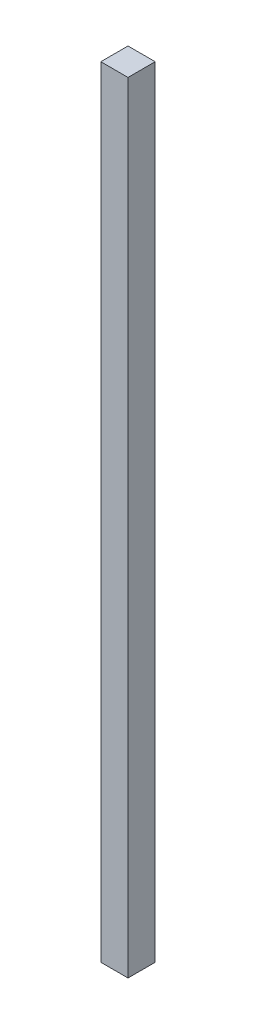
ISO-10303-21;
HEADER;
FILE_DESCRIPTION(('STEP AP214'),'2;1');
FILE_NAME('part.step','',(''),(''),'','','');
FILE_SCHEMA(('AUTOMOTIVE_DESIGN { 1 0 10303 214 1 1 1 1 }'));
ENDSEC;
DATA;
#1=APPLICATION_CONTEXT('core data for automotive mechanical design processes');
#2=APPLICATION_PROTOCOL_DEFINITION('international standard','automotive_design',2000,#1);
#3=PRODUCT_CONTEXT('',#1,'mechanical');
#4=PRODUCT('Part','Part','',(#3));
#5=PRODUCT_RELATED_PRODUCT_CATEGORY('part','',(#4));
#6=PRODUCT_DEFINITION_FORMATION('','',#4);
#7=PRODUCT_DEFINITION_CONTEXT('part definition',#1,'design');
#8=PRODUCT_DEFINITION('design','',#6,#7);
#9=PRODUCT_DEFINITION_SHAPE('','',#8);
#10=(LENGTH_UNIT() NAMED_UNIT(*) SI_UNIT(.MILLI.,.METRE.));
#11=(NAMED_UNIT(*) PLANE_ANGLE_UNIT() SI_UNIT($,.RADIAN.));
#12=(NAMED_UNIT(*) SI_UNIT($,.STERADIAN.) SOLID_ANGLE_UNIT());
#13=UNCERTAINTY_MEASURE_WITH_UNIT(LENGTH_MEASURE(1.E-05),#10,'distance_accuracy_value','');
#14=(GEOMETRIC_REPRESENTATION_CONTEXT(3) GLOBAL_UNCERTAINTY_ASSIGNED_CONTEXT((#13)) GLOBAL_UNIT_ASSIGNED_CONTEXT((#10,
#11,#12)) REPRESENTATION_CONTEXT('',''));
#15=CARTESIAN_POINT('',(0.,0.,0.));
#16=DIRECTION('',(0.,0.,1.));
#17=DIRECTION('',(1.,0.,0.));
#18=AXIS2_PLACEMENT_3D('',#15,#16,#17);
#19=CARTESIAN_POINT('',(0.,1092.2,0.));
#20=DIRECTION('',(1.,0.,0.));
#21=DIRECTION('',(0.,0.,-1.));
#22=AXIS2_PLACEMENT_3D('',#19,#20,#21);
#23=PLANE('',#22);
#24=DIRECTION('',(0.,0.,1.));
#25=VECTOR('',#24,1.);
#26=CARTESIAN_POINT('',(0.,0.,0.));
#27=LINE('',#26,#25);
#28=CARTESIAN_POINT('',(0.,0.,-38.1));
#29=VERTEX_POINT('',#28);
#30=CARTESIAN_POINT('',(0.,0.,0.));
#31=VERTEX_POINT('',#30);
#32=EDGE_CURVE('E96',#29,#31,#27,.T.);
#33=ORIENTED_EDGE('',*,*,#32,.T.);
#34=DIRECTION('',(0.,-1.,0.));
#35=VECTOR('',#34,1.);
#36=CARTESIAN_POINT('',(0.,1092.2,0.));
#37=LINE('',#36,#35);
#38=CARTESIAN_POINT('',(0.,1092.2,0.));
#39=VERTEX_POINT('',#38);
#40=EDGE_CURVE('E11',#39,#31,#37,.T.);
#41=ORIENTED_EDGE('',*,*,#40,.F.);
#42=DIRECTION('',(0.,0.,1.));
#43=VECTOR('',#42,1.);
#44=CARTESIAN_POINT('',(0.,1092.2,0.));
#45=LINE('',#44,#43);
#46=CARTESIAN_POINT('',(0.,1092.2,-38.1));
#47=VERTEX_POINT('',#46);
#48=EDGE_CURVE('E84',#47,#39,#45,.T.);
#49=ORIENTED_EDGE('',*,*,#48,.F.);
#50=DIRECTION('',(0.,-1.,0.));
#51=VECTOR('',#50,1.);
#52=CARTESIAN_POINT('',(0.,1092.2,-38.1));
#53=LINE('',#52,#51);
#54=EDGE_CURVE('E92',#47,#29,#53,.T.);
#55=ORIENTED_EDGE('',*,*,#54,.T.);
#56=EDGE_LOOP('',(#33,#41,#49,#55));
#57=FACE_BOUND('',#56,.T.);
#58=ADVANCED_FACE('F33',(#57),#23,.F.);
#59=CARTESIAN_POINT('',(0.,1092.2,0.));
#60=DIRECTION('',(0.,0.,-1.));
#61=DIRECTION('',(-1.,0.,0.));
#62=AXIS2_PLACEMENT_3D('',#59,#60,#61);
#63=PLANE('',#62);
#64=DIRECTION('',(1.,0.,0.));
#65=VECTOR('',#64,1.);
#66=CARTESIAN_POINT('',(0.,0.,0.));
#67=LINE('',#66,#65);
#68=CARTESIAN_POINT('',(38.1,0.,0.));
#69=VERTEX_POINT('',#68);
#70=EDGE_CURVE('E88',#31,#69,#67,.T.);
#71=ORIENTED_EDGE('',*,*,#70,.T.);
#72=DIRECTION('',(0.,-1.,0.));
#73=VECTOR('',#72,1.);
#74=CARTESIAN_POINT('',(38.1,1092.2,0.));
#75=LINE('',#74,#73);
#76=CARTESIAN_POINT('',(38.1,1092.2,0.));
#77=VERTEX_POINT('',#76);
#78=EDGE_CURVE('E41',#77,#69,#75,.T.);
#79=ORIENTED_EDGE('',*,*,#78,.F.);
#80=DIRECTION('',(1.,0.,0.));
#81=VECTOR('',#80,1.);
#82=CARTESIAN_POINT('',(0.,1092.2,0.));
#83=LINE('',#82,#81);
#84=EDGE_CURVE('E79',#39,#77,#83,.T.);
#85=ORIENTED_EDGE('',*,*,#84,.F.);
#86=ORIENTED_EDGE('',*,*,#40,.T.);
#87=EDGE_LOOP('',(#71,#79,#85,#86));
#88=FACE_BOUND('',#87,.T.);
#89=ADVANCED_FACE('F87',(#88),#63,.F.);
#90=CARTESIAN_POINT('',(38.1,1092.2,0.));
#91=DIRECTION('',(-1.,0.,0.));
#92=DIRECTION('',(0.,0.,1.));
#93=AXIS2_PLACEMENT_3D('',#90,#91,#92);
#94=PLANE('',#93);
#95=DIRECTION('',(0.,0.,-1.));
#96=VECTOR('',#95,1.);
#97=CARTESIAN_POINT('',(38.1,0.,0.));
#98=LINE('',#97,#96);
#99=CARTESIAN_POINT('',(38.1,0.,-38.1));
#100=VERTEX_POINT('',#99);
#101=EDGE_CURVE('E66',#69,#100,#98,.T.);
#102=ORIENTED_EDGE('',*,*,#101,.T.);
#103=DIRECTION('',(0.,-1.,0.));
#104=VECTOR('',#103,1.);
#105=CARTESIAN_POINT('',(38.1,1092.2,-38.1));
#106=LINE('',#105,#104);
#107=CARTESIAN_POINT('',(38.1,1092.2,-38.1));
#108=VERTEX_POINT('',#107);
#109=EDGE_CURVE('E89',#108,#100,#106,.T.);
#110=ORIENTED_EDGE('',*,*,#109,.F.);
#111=DIRECTION('',(0.,0.,-1.));
#112=VECTOR('',#111,1.);
#113=CARTESIAN_POINT('',(38.1,1092.2,0.));
#114=LINE('',#113,#112);
#115=EDGE_CURVE('E82',#77,#108,#114,.T.);
#116=ORIENTED_EDGE('',*,*,#115,.F.);
#117=ORIENTED_EDGE('',*,*,#78,.T.);
#118=EDGE_LOOP('',(#102,#110,#116,#117));
#119=FACE_BOUND('',#118,.T.);
#120=ADVANCED_FACE('F90',(#119),#94,.F.);
#121=CARTESIAN_POINT('',(0.,1092.2,-38.1));
#122=DIRECTION('',(0.,0.,1.));
#123=DIRECTION('',(1.,0.,0.));
#124=AXIS2_PLACEMENT_3D('',#121,#122,#123);
#125=PLANE('',#124);
#126=DIRECTION('',(-1.,0.,0.));
#127=VECTOR('',#126,1.);
#128=CARTESIAN_POINT('',(0.,0.,-38.1));
#129=LINE('',#128,#127);
#130=EDGE_CURVE('E72',#100,#29,#129,.T.);
#131=ORIENTED_EDGE('',*,*,#130,.T.);
#132=ORIENTED_EDGE('',*,*,#54,.F.);
#133=DIRECTION('',(-1.,0.,0.));
#134=VECTOR('',#133,1.);
#135=CARTESIAN_POINT('',(0.,1092.2,-38.1));
#136=LINE('',#135,#134);
#137=EDGE_CURVE('E49',#108,#47,#136,.T.);
#138=ORIENTED_EDGE('',*,*,#137,.F.);
#139=ORIENTED_EDGE('',*,*,#109,.T.);
#140=EDGE_LOOP('',(#131,#132,#138,#139));
#141=FACE_BOUND('',#140,.T.);
#142=ADVANCED_FACE('F103',(#141),#125,.F.);
#143=CARTESIAN_POINT('',(0.,1092.2,0.));
#144=DIRECTION('',(0.,-1.,0.));
#145=DIRECTION('',(0.,0.,-1.));
#146=AXIS2_PLACEMENT_3D('',#143,#144,#145);
#147=PLANE('',#146);
#148=ORIENTED_EDGE('',*,*,#48,.T.);
#149=ORIENTED_EDGE('',*,*,#84,.T.);
#150=ORIENTED_EDGE('',*,*,#115,.T.);
#151=ORIENTED_EDGE('',*,*,#137,.T.);
#152=EDGE_LOOP('',(#148,#149,#150,#151));
#153=FACE_BOUND('',#152,.T.);
#154=ADVANCED_FACE('F80',(#153),#147,.F.);
#155=CARTESIAN_POINT('',(0.,0.,0.));
#156=DIRECTION('',(0.,-1.,0.));
#157=DIRECTION('',(0.,0.,-1.));
#158=AXIS2_PLACEMENT_3D('',#155,#156,#157);
#159=PLANE('',#158);
#160=ORIENTED_EDGE('',*,*,#32,.F.);
#161=ORIENTED_EDGE('',*,*,#130,.F.);
#162=ORIENTED_EDGE('',*,*,#101,.F.);
#163=ORIENTED_EDGE('',*,*,#70,.F.);
#164=EDGE_LOOP('',(#160,#161,#162,#163));
#165=FACE_BOUND('',#164,.T.);
#166=ADVANCED_FACE('F106',(#165),#159,.T.);
#167=CLOSED_SHELL('',(#58,#89,#120,#142,#154,#166));
#168=MANIFOLD_SOLID_BREP('B2',#167);
#169=ADVANCED_BREP_SHAPE_REPRESENTATION('',(#18,#168),#14);
#170=SHAPE_DEFINITION_REPRESENTATION(#9,#169);
ENDSEC;
END-ISO-10303-21;
